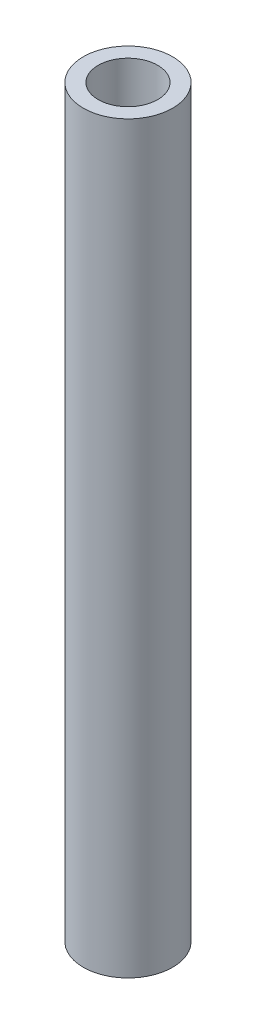
ISO-10303-21;
HEADER;
FILE_DESCRIPTION(('STEP AP214'),'2;1');
FILE_NAME('part.step','',(''),(''),'','','');
FILE_SCHEMA(('AUTOMOTIVE_DESIGN { 1 0 10303 214 1 1 1 1 }'));
ENDSEC;
DATA;
#1=APPLICATION_CONTEXT('core data for automotive mechanical design processes');
#2=APPLICATION_PROTOCOL_DEFINITION('international standard','automotive_design',2000,#1);
#3=PRODUCT_CONTEXT('',#1,'mechanical');
#4=PRODUCT('Part','Part','',(#3));
#5=PRODUCT_RELATED_PRODUCT_CATEGORY('part','',(#4));
#6=PRODUCT_DEFINITION_FORMATION('','',#4);
#7=PRODUCT_DEFINITION_CONTEXT('part definition',#1,'design');
#8=PRODUCT_DEFINITION('design','',#6,#7);
#9=PRODUCT_DEFINITION_SHAPE('','',#8);
#10=(LENGTH_UNIT() NAMED_UNIT(*) SI_UNIT(.MILLI.,.METRE.));
#11=(NAMED_UNIT(*) PLANE_ANGLE_UNIT() SI_UNIT($,.RADIAN.));
#12=(NAMED_UNIT(*) SI_UNIT($,.STERADIAN.) SOLID_ANGLE_UNIT());
#13=UNCERTAINTY_MEASURE_WITH_UNIT(LENGTH_MEASURE(1.E-05),#10,'distance_accuracy_value','');
#14=(GEOMETRIC_REPRESENTATION_CONTEXT(3) GLOBAL_UNCERTAINTY_ASSIGNED_CONTEXT((#13)) GLOBAL_UNIT_ASSIGNED_CONTEXT((#10,
#11,#12)) REPRESENTATION_CONTEXT('',''));
#15=CARTESIAN_POINT('',(0.,0.,0.));
#16=DIRECTION('',(0.,0.,1.));
#17=DIRECTION('',(1.,0.,0.));
#18=AXIS2_PLACEMENT_3D('',#15,#16,#17);
#19=CARTESIAN_POINT('',(0.,500.,0.));
#20=DIRECTION('',(0.,1.,0.));
#21=DIRECTION('',(0.,0.,1.));
#22=AXIS2_PLACEMENT_3D('',#19,#20,#21);
#23=PLANE('',#22);
#24=CARTESIAN_POINT('',(0.,500.,0.));
#25=DIRECTION('',(0.,1.,0.));
#26=DIRECTION('',(0.,0.,1.));
#27=AXIS2_PLACEMENT_3D('',#24,#25,#26);
#28=CIRCLE('',#27,30.);
#29=CARTESIAN_POINT('',(0.,500.,30.));
#30=VERTEX_POINT('',#29);
#31=EDGE_CURVE('E10',#30,#30,#28,.T.);
#32=ORIENTED_EDGE('',*,*,#31,.T.);
#33=EDGE_LOOP('',(#32));
#34=FACE_BOUND('',#33,.T.);
#35=CARTESIAN_POINT('',(0.,500.,0.));
#36=DIRECTION('',(0.,1.,0.));
#37=DIRECTION('',(0.,0.,1.));
#38=AXIS2_PLACEMENT_3D('',#35,#36,#37);
#39=CIRCLE('',#38,20.);
#40=CARTESIAN_POINT('',(0.,500.,20.));
#41=VERTEX_POINT('',#40);
#42=EDGE_CURVE('E48',#41,#41,#39,.T.);
#43=ORIENTED_EDGE('',*,*,#42,.F.);
#44=EDGE_LOOP('',(#43));
#45=FACE_BOUND('',#44,.T.);
#46=ADVANCED_FACE('F37',(#34,#45),#23,.T.);
#47=CARTESIAN_POINT('',(0.,0.,0.));
#48=DIRECTION('',(0.,1.,0.));
#49=DIRECTION('',(0.,0.,1.));
#50=AXIS2_PLACEMENT_3D('',#47,#48,#49);
#51=PLANE('',#50);
#52=CARTESIAN_POINT('',(0.,0.,0.));
#53=DIRECTION('',(0.,1.,0.));
#54=DIRECTION('',(0.,0.,1.));
#55=AXIS2_PLACEMENT_3D('',#52,#53,#54);
#56=CIRCLE('',#55,30.);
#57=CARTESIAN_POINT('',(0.,0.,30.));
#58=VERTEX_POINT('',#57);
#59=EDGE_CURVE('E41',#58,#58,#56,.T.);
#60=ORIENTED_EDGE('',*,*,#59,.F.);
#61=EDGE_LOOP('',(#60));
#62=FACE_BOUND('',#61,.T.);
#63=CARTESIAN_POINT('',(0.,0.,0.));
#64=DIRECTION('',(0.,1.,0.));
#65=DIRECTION('',(0.,0.,1.));
#66=AXIS2_PLACEMENT_3D('',#63,#64,#65);
#67=CIRCLE('',#66,20.);
#68=CARTESIAN_POINT('',(0.,0.,20.));
#69=VERTEX_POINT('',#68);
#70=EDGE_CURVE('E50',#69,#69,#67,.T.);
#71=ORIENTED_EDGE('',*,*,#70,.T.);
#72=EDGE_LOOP('',(#71));
#73=FACE_BOUND('',#72,.T.);
#74=ADVANCED_FACE('F60',(#62,#73),#51,.F.);
#75=CARTESIAN_POINT('',(0.,500.,0.));
#76=DIRECTION('',(0.,-1.,0.));
#77=DIRECTION('',(0.,0.,-1.));
#78=AXIS2_PLACEMENT_3D('',#75,#76,#77);
#79=CYLINDRICAL_SURFACE('',#78,30.);
#80=ORIENTED_EDGE('',*,*,#31,.F.);
#81=EDGE_LOOP('',(#80));
#82=FACE_BOUND('',#81,.T.);
#83=ORIENTED_EDGE('',*,*,#59,.T.);
#84=EDGE_LOOP('',(#83));
#85=FACE_BOUND('',#84,.T.);
#86=ADVANCED_FACE('F39',(#82,#85),#79,.T.);
#87=CARTESIAN_POINT('',(0.,500.,0.));
#88=DIRECTION('',(0.,-1.,0.));
#89=DIRECTION('',(0.,0.,-1.));
#90=AXIS2_PLACEMENT_3D('',#87,#88,#89);
#91=CYLINDRICAL_SURFACE('',#90,20.);
#92=ORIENTED_EDGE('',*,*,#42,.T.);
#93=EDGE_LOOP('',(#92));
#94=FACE_BOUND('',#93,.T.);
#95=ORIENTED_EDGE('',*,*,#70,.F.);
#96=EDGE_LOOP('',(#95));
#97=FACE_BOUND('',#96,.T.);
#98=ADVANCED_FACE('F56',(#94,#97),#91,.F.);
#99=CLOSED_SHELL('',(#46,#74,#86,#98));
#100=MANIFOLD_SOLID_BREP('B2',#99);
#101=ADVANCED_BREP_SHAPE_REPRESENTATION('',(#18,#100),#14);
#102=SHAPE_DEFINITION_REPRESENTATION(#9,#101);
ENDSEC;
END-ISO-10303-21;
